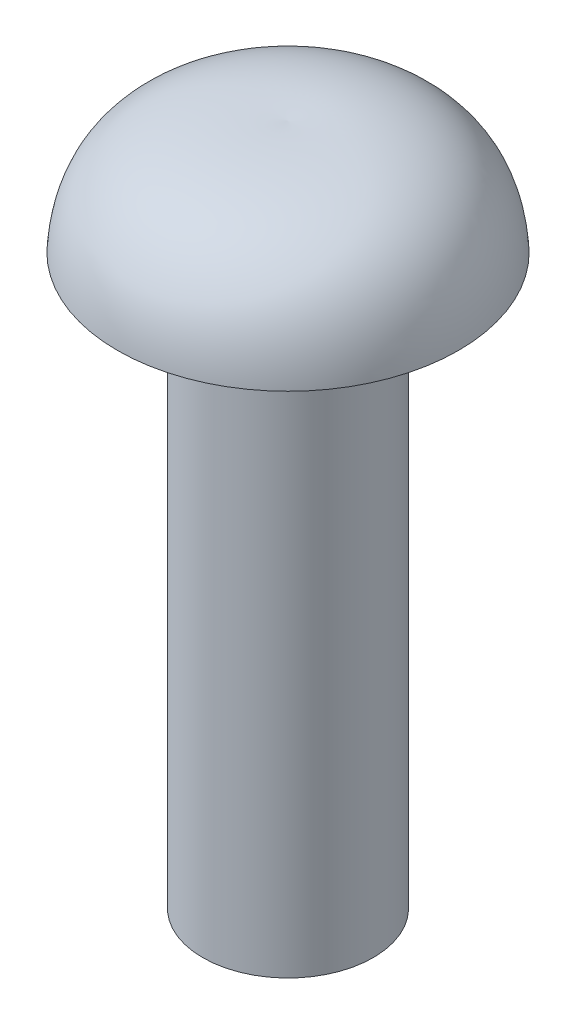
ISO-10303-21;
HEADER;
FILE_DESCRIPTION(('STEP AP214'),'2;1');
FILE_NAME('part.step','',(''),(''),'','','');
FILE_SCHEMA(('AUTOMOTIVE_DESIGN { 1 0 10303 214 1 1 1 1 }'));
ENDSEC;
DATA;
#1=APPLICATION_CONTEXT('core data for automotive mechanical design processes');
#2=APPLICATION_PROTOCOL_DEFINITION('international standard','automotive_design',2000,#1);
#3=PRODUCT_CONTEXT('',#1,'mechanical');
#4=PRODUCT('Part','Part','',(#3));
#5=PRODUCT_RELATED_PRODUCT_CATEGORY('part','',(#4));
#6=PRODUCT_DEFINITION_FORMATION('','',#4);
#7=PRODUCT_DEFINITION_CONTEXT('part definition',#1,'design');
#8=PRODUCT_DEFINITION('design','',#6,#7);
#9=PRODUCT_DEFINITION_SHAPE('','',#8);
#10=(LENGTH_UNIT() NAMED_UNIT(*) SI_UNIT(.MILLI.,.METRE.));
#11=(NAMED_UNIT(*) PLANE_ANGLE_UNIT() SI_UNIT($,.RADIAN.));
#12=(NAMED_UNIT(*) SI_UNIT($,.STERADIAN.) SOLID_ANGLE_UNIT());
#13=UNCERTAINTY_MEASURE_WITH_UNIT(LENGTH_MEASURE(1.E-05),#10,'distance_accuracy_value','');
#14=(GEOMETRIC_REPRESENTATION_CONTEXT(3) GLOBAL_UNCERTAINTY_ASSIGNED_CONTEXT((#13)) GLOBAL_UNIT_ASSIGNED_CONTEXT((#10,
#11,#12)) REPRESENTATION_CONTEXT('',''));
#15=CARTESIAN_POINT('',(0.,0.,0.));
#16=DIRECTION('',(0.,0.,1.));
#17=DIRECTION('',(1.,0.,0.));
#18=AXIS2_PLACEMENT_3D('',#15,#16,#17);
#19=CARTESIAN_POINT('',(0.,10.,0.));
#20=DIRECTION('',(0.,-1.,0.));
#21=DIRECTION('',(0.,0.,-1.));
#22=AXIS2_PLACEMENT_3D('',#19,#20,#21);
#23=CYLINDRICAL_SURFACE('',#22,1.5);
#24=CARTESIAN_POINT('',(0.,10.,0.));
#25=DIRECTION('',(0.,1.,0.));
#26=DIRECTION('',(0.,0.,1.));
#27=AXIS2_PLACEMENT_3D('',#24,#25,#26);
#28=CIRCLE('',#27,1.5);
#29=CARTESIAN_POINT('',(0.,10.,1.5));
#30=VERTEX_POINT('',#29);
#31=EDGE_CURVE('E11',#30,#30,#28,.T.);
#32=ORIENTED_EDGE('',*,*,#31,.F.);
#33=EDGE_LOOP('',(#32));
#34=FACE_BOUND('',#33,.T.);
#35=CARTESIAN_POINT('',(0.,0.,0.));
#36=DIRECTION('',(0.,1.,0.));
#37=DIRECTION('',(0.,0.,1.));
#38=AXIS2_PLACEMENT_3D('',#35,#36,#37);
#39=CIRCLE('',#38,1.5);
#40=CARTESIAN_POINT('',(0.,0.,1.5));
#41=VERTEX_POINT('',#40);
#42=EDGE_CURVE('E37',#41,#41,#39,.T.);
#43=ORIENTED_EDGE('',*,*,#42,.T.);
#44=EDGE_LOOP('',(#43));
#45=FACE_BOUND('',#44,.T.);
#46=ADVANCED_FACE('F34',(#34,#45),#23,.T.);
#47=CARTESIAN_POINT('',(0.,0.,0.));
#48=DIRECTION('',(0.,1.,0.));
#49=DIRECTION('',(0.,0.,1.));
#50=AXIS2_PLACEMENT_3D('',#47,#48,#49);
#51=PLANE('',#50);
#52=ORIENTED_EDGE('',*,*,#42,.F.);
#53=EDGE_LOOP('',(#52));
#54=FACE_BOUND('',#53,.T.);
#55=ADVANCED_FACE('F63',(#54),#51,.F.);
#56=CARTESIAN_POINT('',(0.,10.,0.));
#57=DIRECTION('',(0.,1.,0.));
#58=DIRECTION('',(0.,0.,1.));
#59=AXIS2_PLACEMENT_3D('',#56,#57,#58);
#60=PLANE('',#59);
#61=CARTESIAN_POINT('',(0.,10.,0.));
#62=DIRECTION('',(0.,1.,0.));
#63=DIRECTION('',(0.,0.,1.));
#64=AXIS2_PLACEMENT_3D('',#61,#62,#63);
#65=CIRCLE('',#64,3.);
#66=CARTESIAN_POINT('',(0.,10.,3.));
#67=VERTEX_POINT('',#66);
#68=EDGE_CURVE('E50',#67,#67,#65,.T.);
#69=ORIENTED_EDGE('',*,*,#68,.F.);
#70=EDGE_LOOP('',(#69));
#71=FACE_BOUND('',#70,.T.);
#72=ORIENTED_EDGE('',*,*,#31,.T.);
#73=EDGE_LOOP('',(#72));
#74=FACE_BOUND('',#73,.T.);
#75=ADVANCED_FACE('F46',(#71,#74),#60,.F.);
#76=CARTESIAN_POINT('',(3.,10.,0.));
#77=CARTESIAN_POINT('',(2.85092332892683,12.1997575486228,0.));
#78=CARTESIAN_POINT('',(0.,12.,0.));
#79=B_SPLINE_CURVE_WITH_KNOTS('',2,(#76,#77,#78),.UNSPECIFIED.,.F.,.F.,(3,3),(0.,1.),.UNSPECIFIED.);
#80=CARTESIAN_POINT('',(0.,10.,0.));
#81=DIRECTION('',(0.,1.,0.));
#82=AXIS1_PLACEMENT('',#80,#81);
#83=SURFACE_OF_REVOLUTION('',#79,#82);
#84=CARTESIAN_POINT('',(0.,12.,0.));
#85=VERTEX_POINT('',#84);
#86=VERTEX_LOOP('',#85);
#87=FACE_BOUND('',#86,.T.);
#88=ORIENTED_EDGE('',*,*,#68,.T.);
#89=EDGE_LOOP('',(#88));
#90=FACE_BOUND('',#89,.T.);
#91=ADVANCED_FACE('F43',(#87,#90),#83,.T.);
#92=CLOSED_SHELL('',(#46,#55,#75,#91));
#93=MANIFOLD_SOLID_BREP('B2',#92);
#94=ADVANCED_BREP_SHAPE_REPRESENTATION('',(#18,#93),#14);
#95=SHAPE_DEFINITION_REPRESENTATION(#9,#94);
ENDSEC;
END-ISO-10303-21;
